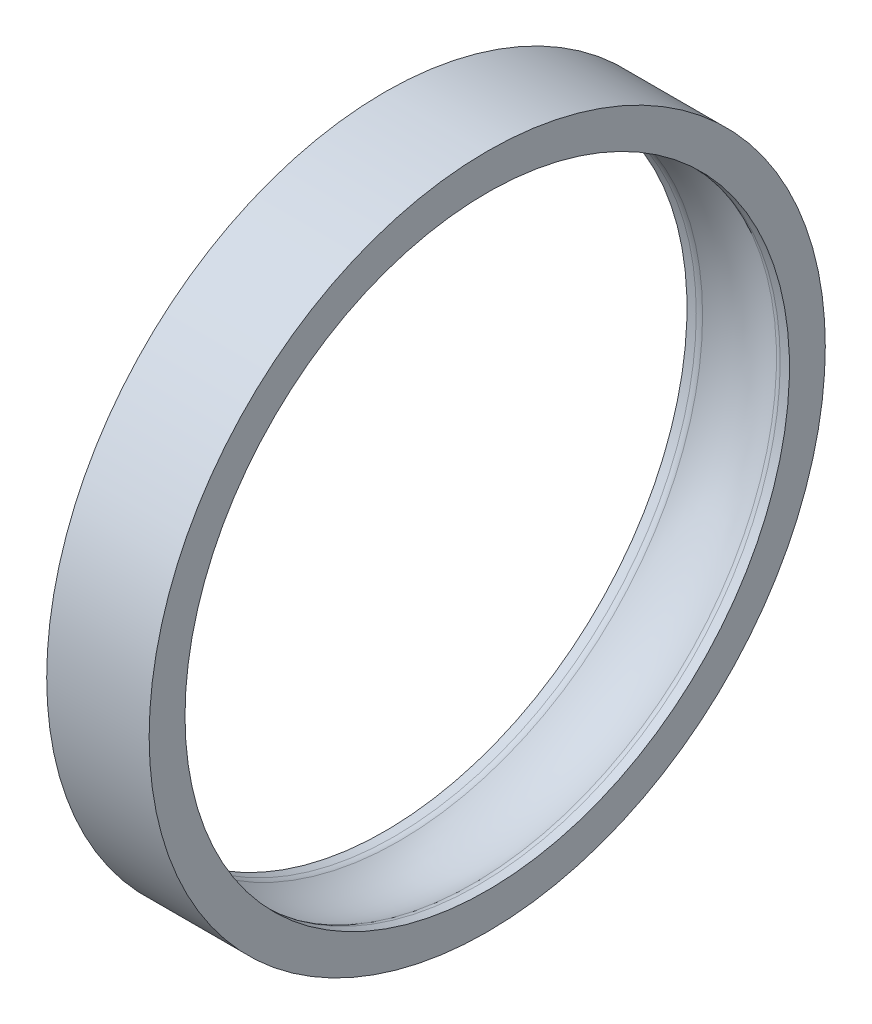
ISO-10303-21;
HEADER;
FILE_DESCRIPTION(('STEP AP214'),'2;1');
FILE_NAME('part.step','',(''),(''),'','','');
FILE_SCHEMA(('AUTOMOTIVE_DESIGN { 1 0 10303 214 1 1 1 1 }'));
ENDSEC;
DATA;
#1=APPLICATION_CONTEXT('core data for automotive mechanical design processes');
#2=APPLICATION_PROTOCOL_DEFINITION('international standard','automotive_design',2000,#1);
#3=PRODUCT_CONTEXT('',#1,'mechanical');
#4=PRODUCT('Part','Part','',(#3));
#5=PRODUCT_RELATED_PRODUCT_CATEGORY('part','',(#4));
#6=PRODUCT_DEFINITION_FORMATION('','',#4);
#7=PRODUCT_DEFINITION_CONTEXT('part definition',#1,'design');
#8=PRODUCT_DEFINITION('design','',#6,#7);
#9=PRODUCT_DEFINITION_SHAPE('','',#8);
#10=(LENGTH_UNIT() NAMED_UNIT(*) SI_UNIT(.MILLI.,.METRE.));
#11=(NAMED_UNIT(*) PLANE_ANGLE_UNIT() SI_UNIT($,.RADIAN.));
#12=(NAMED_UNIT(*) SI_UNIT($,.STERADIAN.) SOLID_ANGLE_UNIT());
#13=UNCERTAINTY_MEASURE_WITH_UNIT(LENGTH_MEASURE(1.E-05),#10,'distance_accuracy_value','');
#14=(GEOMETRIC_REPRESENTATION_CONTEXT(3) GLOBAL_UNCERTAINTY_ASSIGNED_CONTEXT((#13)) GLOBAL_UNIT_ASSIGNED_CONTEXT((#10,
#11,#12)) REPRESENTATION_CONTEXT('',''));
#15=CARTESIAN_POINT('',(0.,0.,0.));
#16=DIRECTION('',(0.,0.,1.));
#17=DIRECTION('',(1.,0.,0.));
#18=AXIS2_PLACEMENT_3D('',#15,#16,#17);
#19=CARTESIAN_POINT('',(0.,0.,0.));
#20=DIRECTION('',(-1.,0.,0.));
#21=DIRECTION('',(0.,0.,1.));
#22=AXIS2_PLACEMENT_3D('',#19,#20,#21);
#23=TOROIDAL_SURFACE('',#22,46.4197072529698,14.7252808743412);
#24=CARTESIAN_POINT('',(7.21461975946075,0.,0.));
#25=DIRECTION('',(-1.,0.,0.));
#26=DIRECTION('',(0.,0.,1.));
#27=AXIS2_PLACEMENT_3D('',#24,#25,#26);
#28=CIRCLE('',#27,59.2564965148778);
#29=CARTESIAN_POINT('',(7.21461975946075,0.,59.2564965148778));
#30=VERTEX_POINT('',#29);
#31=EDGE_CURVE('E40',#30,#30,#28,.F.);
#32=ORIENTED_EDGE('',*,*,#31,.T.);
#33=EDGE_LOOP('',(#32));
#34=FACE_BOUND('',#33,.T.);
#35=CARTESIAN_POINT('',(-7.21461975946071,0.,0.));
#36=DIRECTION('',(1.,0.,0.));
#37=DIRECTION('',(0.,0.,-1.));
#38=AXIS2_PLACEMENT_3D('',#35,#36,#37);
#39=CIRCLE('',#38,59.2564965148779);
#40=CARTESIAN_POINT('',(-7.21461975946071,0.,-59.2564965148779));
#41=VERTEX_POINT('',#40);
#42=EDGE_CURVE('E44',#41,#41,#39,.F.);
#43=ORIENTED_EDGE('',*,*,#42,.T.);
#44=EDGE_LOOP('',(#43));
#45=FACE_BOUND('',#44,.T.);
#46=ADVANCED_FACE('F33',(#34,#45),#23,.F.);
#47=CARTESIAN_POINT('',(-1000.,0.,0.));
#48=DIRECTION('',(-1.,0.,0.));
#49=DIRECTION('',(0.,0.,1.));
#50=AXIS2_PLACEMENT_3D('',#47,#48,#49);
#51=CYLINDRICAL_SURFACE('',#50,59.);
#52=CARTESIAN_POINT('',(8.19451546685368,0.,0.));
#53=DIRECTION('',(1.,0.,0.));
#54=DIRECTION('',(0.,0.,-1.));
#55=AXIS2_PLACEMENT_3D('',#52,#53,#54);
#56=CIRCLE('',#55,59.);
#57=CARTESIAN_POINT('',(8.19451546685368,0.,-59.));
#58=VERTEX_POINT('',#57);
#59=EDGE_CURVE('E48',#58,#58,#56,.F.);
#60=ORIENTED_EDGE('',*,*,#59,.T.);
#61=EDGE_LOOP('',(#60));
#62=FACE_BOUND('',#61,.T.);
#63=CARTESIAN_POINT('',(10.,0.,0.));
#64=DIRECTION('',(-1.,0.,0.));
#65=DIRECTION('',(0.,0.,1.));
#66=AXIS2_PLACEMENT_3D('',#63,#64,#65);
#67=CIRCLE('',#66,59.);
#68=CARTESIAN_POINT('',(10.,0.,59.));
#69=VERTEX_POINT('',#68);
#70=EDGE_CURVE('E53',#69,#69,#67,.T.);
#71=ORIENTED_EDGE('',*,*,#70,.F.);
#72=EDGE_LOOP('',(#71));
#73=FACE_BOUND('',#72,.T.);
#74=ADVANCED_FACE('F82',(#62,#73),#51,.F.);
#75=CARTESIAN_POINT('',(10.,0.,0.));
#76=DIRECTION('',(1.,0.,0.));
#77=DIRECTION('',(0.,0.,-1.));
#78=AXIS2_PLACEMENT_3D('',#75,#76,#77);
#79=PLANE('',#78);
#80=ORIENTED_EDGE('',*,*,#70,.T.);
#81=EDGE_LOOP('',(#80));
#82=FACE_BOUND('',#81,.T.);
#83=CARTESIAN_POINT('',(10.,0.,0.));
#84=DIRECTION('',(-1.,0.,0.));
#85=DIRECTION('',(0.,0.,1.));
#86=AXIS2_PLACEMENT_3D('',#83,#84,#85);
#87=CIRCLE('',#86,66.);
#88=CARTESIAN_POINT('',(10.,0.,66.));
#89=VERTEX_POINT('',#88);
#90=EDGE_CURVE('E56',#89,#89,#87,.T.);
#91=ORIENTED_EDGE('',*,*,#90,.F.);
#92=EDGE_LOOP('',(#91));
#93=FACE_BOUND('',#92,.T.);
#94=ADVANCED_FACE('F76',(#82,#93),#79,.T.);
#95=CARTESIAN_POINT('',(-1000.,0.,0.));
#96=DIRECTION('',(-1.,0.,0.));
#97=DIRECTION('',(0.,0.,1.));
#98=AXIS2_PLACEMENT_3D('',#95,#96,#97);
#99=CYLINDRICAL_SURFACE('',#98,66.);
#100=ORIENTED_EDGE('',*,*,#90,.T.);
#101=EDGE_LOOP('',(#100));
#102=FACE_BOUND('',#101,.T.);
#103=CARTESIAN_POINT('',(-10.,0.,0.));
#104=DIRECTION('',(-1.,0.,0.));
#105=DIRECTION('',(0.,0.,1.));
#106=AXIS2_PLACEMENT_3D('',#103,#104,#105);
#107=CIRCLE('',#106,66.);
#108=CARTESIAN_POINT('',(-10.,0.,66.));
#109=VERTEX_POINT('',#108);
#110=EDGE_CURVE('E59',#109,#109,#107,.T.);
#111=ORIENTED_EDGE('',*,*,#110,.F.);
#112=EDGE_LOOP('',(#111));
#113=FACE_BOUND('',#112,.T.);
#114=ADVANCED_FACE('F71',(#102,#113),#99,.T.);
#115=CARTESIAN_POINT('',(-10.,0.,0.));
#116=DIRECTION('',(1.,0.,0.));
#117=DIRECTION('',(0.,0.,-1.));
#118=AXIS2_PLACEMENT_3D('',#115,#116,#117);
#119=PLANE('',#118);
#120=CARTESIAN_POINT('',(-10.,0.,0.));
#121=DIRECTION('',(-1.,0.,0.));
#122=DIRECTION('',(0.,0.,1.));
#123=AXIS2_PLACEMENT_3D('',#120,#121,#122);
#124=CIRCLE('',#123,59.);
#125=CARTESIAN_POINT('',(-10.,0.,59.));
#126=VERTEX_POINT('',#125);
#127=EDGE_CURVE('E62',#126,#126,#124,.T.);
#128=ORIENTED_EDGE('',*,*,#127,.F.);
#129=EDGE_LOOP('',(#128));
#130=FACE_BOUND('',#129,.T.);
#131=ORIENTED_EDGE('',*,*,#110,.T.);
#132=EDGE_LOOP('',(#131));
#133=FACE_BOUND('',#132,.T.);
#134=ADVANCED_FACE('F68',(#130,#133),#119,.F.);
#135=CARTESIAN_POINT('',(-1000.,0.,0.));
#136=DIRECTION('',(-1.,0.,0.));
#137=DIRECTION('',(0.,0.,1.));
#138=AXIS2_PLACEMENT_3D('',#135,#136,#137);
#139=CYLINDRICAL_SURFACE('',#138,59.);
#140=CARTESIAN_POINT('',(-8.19451546685357,0.,0.));
#141=DIRECTION('',(1.,0.,0.));
#142=DIRECTION('',(0.,0.,-1.));
#143=AXIS2_PLACEMENT_3D('',#140,#141,#142);
#144=CIRCLE('',#143,59.);
#145=CARTESIAN_POINT('',(-8.19451546685357,0.,-59.));
#146=VERTEX_POINT('',#145);
#147=EDGE_CURVE('E10',#146,#146,#144,.T.);
#148=ORIENTED_EDGE('',*,*,#147,.T.);
#149=EDGE_LOOP('',(#148));
#150=FACE_BOUND('',#149,.T.);
#151=ORIENTED_EDGE('',*,*,#127,.T.);
#152=EDGE_LOOP('',(#151));
#153=FACE_BOUND('',#152,.T.);
#154=ADVANCED_FACE('F66',(#150,#153),#139,.F.);
#155=CARTESIAN_POINT('',(8.19451546685368,0.,0.));
#156=DIRECTION('',(1.,0.,0.));
#157=DIRECTION('',(0.,0.,-1.));
#158=AXIS2_PLACEMENT_3D('',#155,#156,#157);
#159=TOROIDAL_SURFACE('',#158,61.,2.);
#160=ORIENTED_EDGE('',*,*,#31,.F.);
#161=EDGE_LOOP('',(#160));
#162=FACE_BOUND('',#161,.T.);
#163=ORIENTED_EDGE('',*,*,#59,.F.);
#164=EDGE_LOOP('',(#163));
#165=FACE_BOUND('',#164,.T.);
#166=ADVANCED_FACE('F93',(#162,#165),#159,.T.);
#167=CARTESIAN_POINT('',(-8.19451546685357,0.,0.));
#168=DIRECTION('',(1.,0.,0.));
#169=DIRECTION('',(0.,0.,-1.));
#170=AXIS2_PLACEMENT_3D('',#167,#168,#169);
#171=TOROIDAL_SURFACE('',#170,61.,2.);
#172=ORIENTED_EDGE('',*,*,#147,.F.);
#173=EDGE_LOOP('',(#172));
#174=FACE_BOUND('',#173,.T.);
#175=ORIENTED_EDGE('',*,*,#42,.F.);
#176=EDGE_LOOP('',(#175));
#177=FACE_BOUND('',#176,.T.);
#178=ADVANCED_FACE('F35',(#174,#177),#171,.T.);
#179=CLOSED_SHELL('',(#46,#74,#94,#114,#134,#154,#166,#178));
#180=MANIFOLD_SOLID_BREP('B2',#179);
#181=ADVANCED_BREP_SHAPE_REPRESENTATION('',(#18,#180),#14);
#182=SHAPE_DEFINITION_REPRESENTATION(#9,#181);
ENDSEC;
END-ISO-10303-21;
